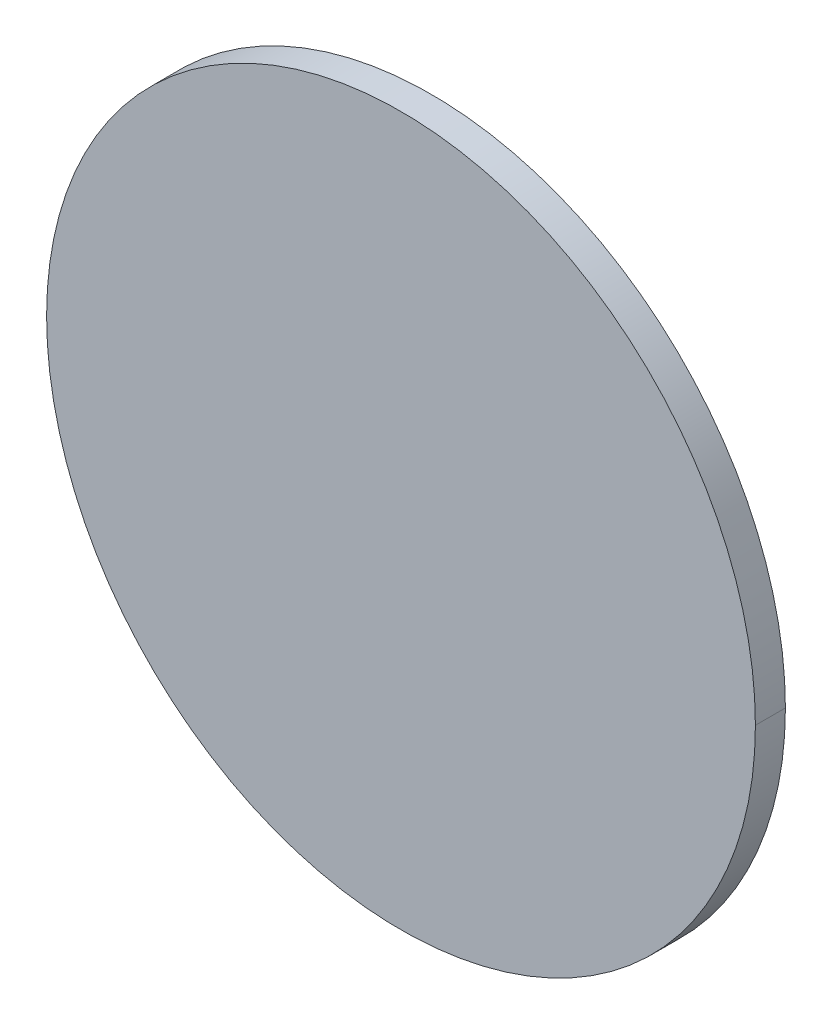
ISO-10303-21;
HEADER;
FILE_DESCRIPTION(('STEP AP214'),'2;1');
FILE_NAME('part.step','',(''),(''),'','','');
FILE_SCHEMA(('AUTOMOTIVE_DESIGN { 1 0 10303 214 1 1 1 1 }'));
ENDSEC;
DATA;
#1=APPLICATION_CONTEXT('core data for automotive mechanical design processes');
#2=APPLICATION_PROTOCOL_DEFINITION('international standard','automotive_design',2000,#1);
#3=PRODUCT_CONTEXT('',#1,'mechanical');
#4=PRODUCT('Part','Part','',(#3));
#5=PRODUCT_RELATED_PRODUCT_CATEGORY('part','',(#4));
#6=PRODUCT_DEFINITION_FORMATION('','',#4);
#7=PRODUCT_DEFINITION_CONTEXT('part definition',#1,'design');
#8=PRODUCT_DEFINITION('design','',#6,#7);
#9=PRODUCT_DEFINITION_SHAPE('','',#8);
#10=(LENGTH_UNIT() NAMED_UNIT(*) SI_UNIT(.MILLI.,.METRE.));
#11=(NAMED_UNIT(*) PLANE_ANGLE_UNIT() SI_UNIT($,.RADIAN.));
#12=(NAMED_UNIT(*) SI_UNIT($,.STERADIAN.) SOLID_ANGLE_UNIT());
#13=UNCERTAINTY_MEASURE_WITH_UNIT(LENGTH_MEASURE(1.E-05),#10,'distance_accuracy_value','');
#14=(GEOMETRIC_REPRESENTATION_CONTEXT(3) GLOBAL_UNCERTAINTY_ASSIGNED_CONTEXT((#13)) GLOBAL_UNIT_ASSIGNED_CONTEXT((#10,
#11,#12)) REPRESENTATION_CONTEXT('',''));
#15=CARTESIAN_POINT('',(0.,0.,0.));
#16=DIRECTION('',(0.,0.,1.));
#17=DIRECTION('',(1.,0.,0.));
#18=AXIS2_PLACEMENT_3D('',#15,#16,#17);
#19=CARTESIAN_POINT('',(5.457399902344,47.88699686002,1.1723000001));
#20=DIRECTION('',(0.,0.,1.));
#21=DIRECTION('',(1.,0.,0.));
#22=AXIS2_PLACEMENT_3D('',#19,#20,#21);
#23=PLANE('',#22);
#24=CARTESIAN_POINT('',(5.457399902344,47.88699686002,1.1723000001));
#25=DIRECTION('',(0.,0.,-1.));
#26=DIRECTION('',(1.,0.,0.));
#27=AXIS2_PLACEMENT_3D('',#24,#25,#26);
#28=CIRCLE('',#27,0.150000210293);
#29=CARTESIAN_POINT('',(5.607400112636,47.88699686002,1.1723000001));
#30=VERTEX_POINT('',#29);
#31=CARTESIAN_POINT('',(5.307399692051,47.88699686002,1.1723000001));
#32=VERTEX_POINT('',#31);
#33=EDGE_CURVE('E11',#30,#32,#28,.T.);
#34=ORIENTED_EDGE('',*,*,#33,.F.);
#35=CARTESIAN_POINT('',(5.457399902344,47.88699686002,1.1723000001));
#36=DIRECTION('',(0.,0.,-1.));
#37=DIRECTION('',(1.,0.,0.));
#38=AXIS2_PLACEMENT_3D('',#35,#36,#37);
#39=CIRCLE('',#38,0.150000210293);
#40=EDGE_CURVE('E64',#32,#30,#39,.T.);
#41=ORIENTED_EDGE('',*,*,#40,.F.);
#42=EDGE_LOOP('',(#34,#41));
#43=FACE_BOUND('',#42,.T.);
#44=ADVANCED_FACE('F17',(#43),#23,.T.);
#45=CARTESIAN_POINT('',(5.457399902344,47.88699686002,1.1596000001));
#46=DIRECTION('',(0.,0.,1.));
#47=DIRECTION('',(1.,0.,0.));
#48=AXIS2_PLACEMENT_3D('',#45,#46,#47);
#49=CYLINDRICAL_SURFACE('',#48,0.150000210293);
#50=DIRECTION('',(0.,0.,1.));
#51=VECTOR('',#50,1.);
#52=CARTESIAN_POINT('',(5.307399692051,47.88699686002,1.1596000001));
#53=LINE('',#52,#51);
#54=CARTESIAN_POINT('',(5.307399692051,47.88699686002,1.1596000001));
#55=VERTEX_POINT('',#54);
#56=EDGE_CURVE('E21',#55,#32,#53,.T.);
#57=ORIENTED_EDGE('',*,*,#56,.F.);
#58=CARTESIAN_POINT('',(5.457399902344,47.88699686002,1.1596000001));
#59=DIRECTION('',(0.,0.,1.));
#60=DIRECTION('',(1.,0.,0.));
#61=AXIS2_PLACEMENT_3D('',#58,#59,#60);
#62=CIRCLE('',#61,0.150000210293);
#63=CARTESIAN_POINT('',(5.607400112636,47.88699686002,1.1596000001));
#64=VERTEX_POINT('',#63);
#65=EDGE_CURVE('E28',#55,#64,#62,.T.);
#66=ORIENTED_EDGE('',*,*,#65,.T.);
#67=DIRECTION('',(0.,0.,1.));
#68=VECTOR('',#67,1.);
#69=CARTESIAN_POINT('',(5.607400112636,47.88699686002,1.1596000001));
#70=LINE('',#69,#68);
#71=EDGE_CURVE('E56',#64,#30,#70,.T.);
#72=ORIENTED_EDGE('',*,*,#71,.T.);
#73=ORIENTED_EDGE('',*,*,#33,.T.);
#74=EDGE_LOOP('',(#57,#66,#72,#73));
#75=FACE_BOUND('',#74,.T.);
#76=ADVANCED_FACE('F55',(#75),#49,.T.);
#77=CARTESIAN_POINT('',(5.457399902344,47.88699686002,1.1596000001));
#78=DIRECTION('',(0.,0.,1.));
#79=DIRECTION('',(1.,0.,0.));
#80=AXIS2_PLACEMENT_3D('',#77,#78,#79);
#81=PLANE('',#80);
#82=CARTESIAN_POINT('',(5.457399902344,47.88699686002,1.1596000001));
#83=DIRECTION('',(0.,0.,1.));
#84=DIRECTION('',(1.,0.,0.));
#85=AXIS2_PLACEMENT_3D('',#82,#83,#84);
#86=CIRCLE('',#85,0.150000210293);
#87=EDGE_CURVE('E63',#64,#55,#86,.T.);
#88=ORIENTED_EDGE('',*,*,#87,.F.);
#89=ORIENTED_EDGE('',*,*,#65,.F.);
#90=EDGE_LOOP('',(#88,#89));
#91=FACE_BOUND('',#90,.T.);
#92=ADVANCED_FACE('F66',(#91),#81,.F.);
#93=CARTESIAN_POINT('',(5.457399902344,47.88699686002,1.1596000001));
#94=DIRECTION('',(0.,0.,1.));
#95=DIRECTION('',(1.,0.,0.));
#96=AXIS2_PLACEMENT_3D('',#93,#94,#95);
#97=CYLINDRICAL_SURFACE('',#96,0.150000210293);
#98=ORIENTED_EDGE('',*,*,#87,.T.);
#99=ORIENTED_EDGE('',*,*,#56,.T.);
#100=ORIENTED_EDGE('',*,*,#40,.T.);
#101=ORIENTED_EDGE('',*,*,#71,.F.);
#102=EDGE_LOOP('',(#98,#99,#100,#101));
#103=FACE_BOUND('',#102,.T.);
#104=ADVANCED_FACE('F19',(#103),#97,.T.);
#105=CLOSED_SHELL('',(#44,#76,#92,#104));
#106=MANIFOLD_SOLID_BREP('B1',#105);
#107=ADVANCED_BREP_SHAPE_REPRESENTATION('',(#18,#106),#14);
#108=SHAPE_DEFINITION_REPRESENTATION(#9,#107);
ENDSEC;
END-ISO-10303-21;
